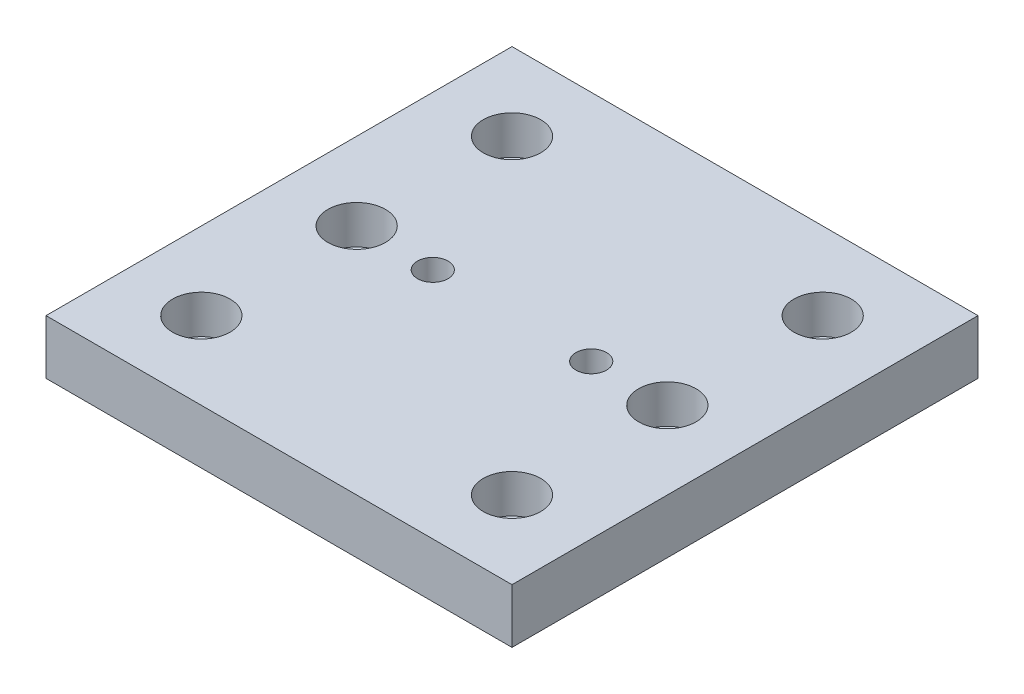
ISO-10303-21;
HEADER;
FILE_DESCRIPTION(('STEP AP214'),'2;1');
FILE_NAME('part.step','',(''),(''),'','','');
FILE_SCHEMA(('AUTOMOTIVE_DESIGN { 1 0 10303 214 1 1 1 1 }'));
ENDSEC;
DATA;
#1=APPLICATION_CONTEXT('core data for automotive mechanical design processes');
#2=APPLICATION_PROTOCOL_DEFINITION('international standard','automotive_design',2000,#1);
#3=PRODUCT_CONTEXT('',#1,'mechanical');
#4=PRODUCT('Part','Part','',(#3));
#5=PRODUCT_RELATED_PRODUCT_CATEGORY('part','',(#4));
#6=PRODUCT_DEFINITION_FORMATION('','',#4);
#7=PRODUCT_DEFINITION_CONTEXT('part definition',#1,'design');
#8=PRODUCT_DEFINITION('design','',#6,#7);
#9=PRODUCT_DEFINITION_SHAPE('','',#8);
#10=(LENGTH_UNIT() NAMED_UNIT(*) SI_UNIT(.MILLI.,.METRE.));
#11=(NAMED_UNIT(*) PLANE_ANGLE_UNIT() SI_UNIT($,.RADIAN.));
#12=(NAMED_UNIT(*) SI_UNIT($,.STERADIAN.) SOLID_ANGLE_UNIT());
#13=UNCERTAINTY_MEASURE_WITH_UNIT(LENGTH_MEASURE(1.E-05),#10,'distance_accuracy_value','');
#14=(GEOMETRIC_REPRESENTATION_CONTEXT(3) GLOBAL_UNCERTAINTY_ASSIGNED_CONTEXT((#13)) GLOBAL_UNIT_ASSIGNED_CONTEXT((#10,
#11,#12)) REPRESENTATION_CONTEXT('',''));
#15=CARTESIAN_POINT('',(0.,0.,0.));
#16=DIRECTION('',(0.,0.,1.));
#17=DIRECTION('',(1.,0.,0.));
#18=AXIS2_PLACEMENT_3D('',#15,#16,#17);
#19=CARTESIAN_POINT('',(-38.1,8.89,-38.1));
#20=DIRECTION('',(1.,0.,0.));
#21=DIRECTION('',(0.,0.,-1.));
#22=AXIS2_PLACEMENT_3D('',#19,#20,#21);
#23=PLANE('',#22);
#24=DIRECTION('',(0.,0.,1.));
#25=VECTOR('',#24,1.);
#26=CARTESIAN_POINT('',(-38.1,0.,-38.1));
#27=LINE('',#26,#25);
#28=CARTESIAN_POINT('',(-38.1,0.,-38.1));
#29=VERTEX_POINT('',#28);
#30=CARTESIAN_POINT('',(-38.1,0.,38.0999999999999));
#31=VERTEX_POINT('',#30);
#32=EDGE_CURVE('E119',#29,#31,#27,.T.);
#33=ORIENTED_EDGE('',*,*,#32,.T.);
#34=DIRECTION('',(0.,-1.,0.));
#35=VECTOR('',#34,1.);
#36=CARTESIAN_POINT('',(-38.1,8.89,38.0999999999999));
#37=LINE('',#36,#35);
#38=CARTESIAN_POINT('',(-38.1,8.89,38.0999999999999));
#39=VERTEX_POINT('',#38);
#40=EDGE_CURVE('E11',#39,#31,#37,.T.);
#41=ORIENTED_EDGE('',*,*,#40,.F.);
#42=DIRECTION('',(0.,0.,1.));
#43=VECTOR('',#42,1.);
#44=CARTESIAN_POINT('',(-38.1,8.89,-38.1));
#45=LINE('',#44,#43);
#46=CARTESIAN_POINT('',(-38.1,8.89,-38.1));
#47=VERTEX_POINT('',#46);
#48=EDGE_CURVE('E101',#47,#39,#45,.T.);
#49=ORIENTED_EDGE('',*,*,#48,.F.);
#50=DIRECTION('',(0.,-1.,0.));
#51=VECTOR('',#50,1.);
#52=CARTESIAN_POINT('',(-38.1,8.89,-38.1));
#53=LINE('',#52,#51);
#54=EDGE_CURVE('E115',#47,#29,#53,.T.);
#55=ORIENTED_EDGE('',*,*,#54,.T.);
#56=EDGE_LOOP('',(#33,#41,#49,#55));
#57=FACE_BOUND('',#56,.T.);
#58=ADVANCED_FACE('F49',(#57),#23,.F.);
#59=CARTESIAN_POINT('',(-38.1,8.89,38.0999999999999));
#60=DIRECTION('',(0.,0.,-1.));
#61=DIRECTION('',(-1.,0.,0.));
#62=AXIS2_PLACEMENT_3D('',#59,#60,#61);
#63=PLANE('',#62);
#64=DIRECTION('',(1.,0.,0.));
#65=VECTOR('',#64,1.);
#66=CARTESIAN_POINT('',(-38.1,0.,38.0999999999999));
#67=LINE('',#66,#65);
#68=CARTESIAN_POINT('',(38.1,0.,38.0999999999999));
#69=VERTEX_POINT('',#68);
#70=EDGE_CURVE('E106',#31,#69,#67,.T.);
#71=ORIENTED_EDGE('',*,*,#70,.T.);
#72=DIRECTION('',(0.,-1.,0.));
#73=VECTOR('',#72,1.);
#74=CARTESIAN_POINT('',(38.1,8.89,38.0999999999999));
#75=LINE('',#74,#73);
#76=CARTESIAN_POINT('',(38.1,8.89,38.0999999999999));
#77=VERTEX_POINT('',#76);
#78=EDGE_CURVE('E58',#77,#69,#75,.T.);
#79=ORIENTED_EDGE('',*,*,#78,.F.);
#80=DIRECTION('',(1.,0.,0.));
#81=VECTOR('',#80,1.);
#82=CARTESIAN_POINT('',(-38.1,8.89,38.0999999999999));
#83=LINE('',#82,#81);
#84=EDGE_CURVE('E96',#39,#77,#83,.T.);
#85=ORIENTED_EDGE('',*,*,#84,.F.);
#86=ORIENTED_EDGE('',*,*,#40,.T.);
#87=EDGE_LOOP('',(#71,#79,#85,#86));
#88=FACE_BOUND('',#87,.T.);
#89=ADVANCED_FACE('F105',(#88),#63,.F.);
#90=CARTESIAN_POINT('',(38.1,8.89,-38.1000000000001));
#91=DIRECTION('',(-1.,0.,0.));
#92=DIRECTION('',(0.,0.,1.));
#93=AXIS2_PLACEMENT_3D('',#90,#91,#92);
#94=PLANE('',#93);
#95=DIRECTION('',(0.,0.,-1.));
#96=VECTOR('',#95,1.);
#97=CARTESIAN_POINT('',(38.1,0.,-38.1000000000001));
#98=LINE('',#97,#96);
#99=CARTESIAN_POINT('',(38.1,0.,-38.1000000000001));
#100=VERTEX_POINT('',#99);
#101=EDGE_CURVE('E83',#69,#100,#98,.T.);
#102=ORIENTED_EDGE('',*,*,#101,.T.);
#103=DIRECTION('',(0.,-1.,0.));
#104=VECTOR('',#103,1.);
#105=CARTESIAN_POINT('',(38.1,8.89,-38.1000000000001));
#106=LINE('',#105,#104);
#107=CARTESIAN_POINT('',(38.1,8.89,-38.1000000000001));
#108=VERTEX_POINT('',#107);
#109=EDGE_CURVE('E108',#108,#100,#106,.T.);
#110=ORIENTED_EDGE('',*,*,#109,.F.);
#111=DIRECTION('',(0.,0.,-1.));
#112=VECTOR('',#111,1.);
#113=CARTESIAN_POINT('',(38.1,8.89,-38.1000000000001));
#114=LINE('',#113,#112);
#115=EDGE_CURVE('E99',#77,#108,#114,.T.);
#116=ORIENTED_EDGE('',*,*,#115,.F.);
#117=ORIENTED_EDGE('',*,*,#78,.T.);
#118=EDGE_LOOP('',(#102,#110,#116,#117));
#119=FACE_BOUND('',#118,.T.);
#120=ADVANCED_FACE('F109',(#119),#94,.F.);
#121=CARTESIAN_POINT('',(-38.1,8.89,-38.1));
#122=DIRECTION('',(0.,0.,1.));
#123=DIRECTION('',(1.,0.,0.));
#124=AXIS2_PLACEMENT_3D('',#121,#122,#123);
#125=PLANE('',#124);
#126=DIRECTION('',(-1.,0.,0.));
#127=VECTOR('',#126,1.);
#128=CARTESIAN_POINT('',(-38.1,0.,-38.1));
#129=LINE('',#128,#127);
#130=EDGE_CURVE('E89',#100,#29,#129,.T.);
#131=ORIENTED_EDGE('',*,*,#130,.T.);
#132=ORIENTED_EDGE('',*,*,#54,.F.);
#133=DIRECTION('',(-1.,0.,0.));
#134=VECTOR('',#133,1.);
#135=CARTESIAN_POINT('',(-38.1,8.89,-38.1));
#136=LINE('',#135,#134);
#137=EDGE_CURVE('E66',#108,#47,#136,.T.);
#138=ORIENTED_EDGE('',*,*,#137,.F.);
#139=ORIENTED_EDGE('',*,*,#109,.T.);
#140=EDGE_LOOP('',(#131,#132,#138,#139));
#141=FACE_BOUND('',#140,.T.);
#142=ADVANCED_FACE('F135',(#141),#125,.F.);
#143=CARTESIAN_POINT('',(0.,8.89,0.));
#144=DIRECTION('',(0.,1.,0.));
#145=DIRECTION('',(0.,0.,1.));
#146=AXIS2_PLACEMENT_3D('',#143,#144,#145);
#147=PLANE('',#146);
#148=CARTESIAN_POINT('',(-25.4,8.89,-25.4000000000001));
#149=DIRECTION('',(0.,1.,0.));
#150=DIRECTION('',(0.,0.,1.));
#151=AXIS2_PLACEMENT_3D('',#148,#149,#150);
#152=CIRCLE('',#151,4.7);
#153=CARTESIAN_POINT('',(-25.4,8.89,-20.7000000000001));
#154=VERTEX_POINT('',#153);
#155=EDGE_CURVE('E251',#154,#154,#152,.T.);
#156=ORIENTED_EDGE('',*,*,#155,.F.);
#157=EDGE_LOOP('',(#156));
#158=FACE_BOUND('',#157,.T.);
#159=CARTESIAN_POINT('',(25.4,8.89,-25.4000000000001));
#160=DIRECTION('',(0.,1.,0.));
#161=DIRECTION('',(0.,0.,1.));
#162=AXIS2_PLACEMENT_3D('',#159,#160,#161);
#163=CIRCLE('',#162,4.7);
#164=CARTESIAN_POINT('',(25.4,8.89,-20.7000000000001));
#165=VERTEX_POINT('',#164);
#166=EDGE_CURVE('E235',#165,#165,#163,.T.);
#167=ORIENTED_EDGE('',*,*,#166,.F.);
#168=EDGE_LOOP('',(#167));
#169=FACE_BOUND('',#168,.T.);
#170=CARTESIAN_POINT('',(25.4,8.89,25.3999999999999));
#171=DIRECTION('',(0.,1.,0.));
#172=DIRECTION('',(0.,0.,1.));
#173=AXIS2_PLACEMENT_3D('',#170,#171,#172);
#174=CIRCLE('',#173,4.7);
#175=CARTESIAN_POINT('',(25.4,8.89,30.0999999999999));
#176=VERTEX_POINT('',#175);
#177=EDGE_CURVE('E219',#176,#176,#174,.T.);
#178=ORIENTED_EDGE('',*,*,#177,.F.);
#179=EDGE_LOOP('',(#178));
#180=FACE_BOUND('',#179,.T.);
#181=CARTESIAN_POINT('',(-25.4,8.89,25.3999999999999));
#182=DIRECTION('',(0.,1.,0.));
#183=DIRECTION('',(0.,0.,1.));
#184=AXIS2_PLACEMENT_3D('',#181,#182,#183);
#185=CIRCLE('',#184,4.7);
#186=CARTESIAN_POINT('',(-25.4,8.89,30.0999999999999));
#187=VERTEX_POINT('',#186);
#188=EDGE_CURVE('E203',#187,#187,#185,.T.);
#189=ORIENTED_EDGE('',*,*,#188,.F.);
#190=EDGE_LOOP('',(#189));
#191=FACE_BOUND('',#190,.T.);
#192=CARTESIAN_POINT('',(-25.4,8.89,0.));
#193=DIRECTION('',(0.,1.,0.));
#194=DIRECTION('',(0.,0.,1.));
#195=AXIS2_PLACEMENT_3D('',#192,#193,#194);
#196=CIRCLE('',#195,4.7);
#197=CARTESIAN_POINT('',(-25.4,8.89,4.69999999999993));
#198=VERTEX_POINT('',#197);
#199=EDGE_CURVE('E187',#198,#198,#196,.T.);
#200=ORIENTED_EDGE('',*,*,#199,.F.);
#201=EDGE_LOOP('',(#200));
#202=FACE_BOUND('',#201,.T.);
#203=CARTESIAN_POINT('',(25.4,8.89,0.));
#204=DIRECTION('',(0.,1.,0.));
#205=DIRECTION('',(0.,0.,1.));
#206=AXIS2_PLACEMENT_3D('',#203,#204,#205);
#207=CIRCLE('',#206,4.7);
#208=CARTESIAN_POINT('',(25.4,8.89,4.69999999999993));
#209=VERTEX_POINT('',#208);
#210=EDGE_CURVE('E171',#209,#209,#207,.T.);
#211=ORIENTED_EDGE('',*,*,#210,.F.);
#212=EDGE_LOOP('',(#211));
#213=FACE_BOUND('',#212,.T.);
#214=CARTESIAN_POINT('',(-12.954,8.89,0.));
#215=DIRECTION('',(0.,1.,0.));
#216=DIRECTION('',(0.,0.,1.));
#217=AXIS2_PLACEMENT_3D('',#214,#215,#216);
#218=CIRCLE('',#217,2.49999999999999);
#219=CARTESIAN_POINT('',(-12.954,8.89,2.49999999999993));
#220=VERTEX_POINT('',#219);
#221=EDGE_CURVE('E155',#220,#220,#218,.T.);
#222=ORIENTED_EDGE('',*,*,#221,.F.);
#223=EDGE_LOOP('',(#222));
#224=FACE_BOUND('',#223,.T.);
#225=CARTESIAN_POINT('',(12.954,8.89,0.));
#226=DIRECTION('',(0.,1.,0.));
#227=DIRECTION('',(0.,0.,1.));
#228=AXIS2_PLACEMENT_3D('',#225,#226,#227);
#229=CIRCLE('',#228,2.49999999999999);
#230=CARTESIAN_POINT('',(12.954,8.89,2.49999999999991));
#231=VERTEX_POINT('',#230);
#232=EDGE_CURVE('E147',#231,#231,#229,.T.);
#233=ORIENTED_EDGE('',*,*,#232,.F.);
#234=EDGE_LOOP('',(#233));
#235=FACE_BOUND('',#234,.T.);
#236=ORIENTED_EDGE('',*,*,#48,.T.);
#237=ORIENTED_EDGE('',*,*,#84,.T.);
#238=ORIENTED_EDGE('',*,*,#115,.T.);
#239=ORIENTED_EDGE('',*,*,#137,.T.);
#240=EDGE_LOOP('',(#236,#237,#238,#239));
#241=FACE_BOUND('',#240,.T.);
#242=ADVANCED_FACE('F97',(#158,#169,#180,#191,#202,#213,#224,#235,#241),#147,.T.);
#243=CARTESIAN_POINT('',(0.,0.,0.));
#244=DIRECTION('',(0.,1.,0.));
#245=DIRECTION('',(0.,0.,1.));
#246=AXIS2_PLACEMENT_3D('',#243,#244,#245);
#247=PLANE('',#246);
#248=CARTESIAN_POINT('',(-25.4,0.,-25.4000000000001));
#249=DIRECTION('',(0.,1.,0.));
#250=DIRECTION('',(0.,0.,1.));
#251=AXIS2_PLACEMENT_3D('',#248,#249,#250);
#252=CIRCLE('',#251,3.3);
#253=CARTESIAN_POINT('',(-25.4,0.,-22.1000000000001));
#254=VERTEX_POINT('',#253);
#255=EDGE_CURVE('E239',#254,#254,#252,.T.);
#256=ORIENTED_EDGE('',*,*,#255,.T.);
#257=EDGE_LOOP('',(#256));
#258=FACE_BOUND('',#257,.T.);
#259=CARTESIAN_POINT('',(25.4,0.,-25.4000000000001));
#260=DIRECTION('',(0.,1.,0.));
#261=DIRECTION('',(0.,0.,1.));
#262=AXIS2_PLACEMENT_3D('',#259,#260,#261);
#263=CIRCLE('',#262,3.3);
#264=CARTESIAN_POINT('',(25.4,0.,-22.1000000000001));
#265=VERTEX_POINT('',#264);
#266=EDGE_CURVE('E223',#265,#265,#263,.T.);
#267=ORIENTED_EDGE('',*,*,#266,.T.);
#268=EDGE_LOOP('',(#267));
#269=FACE_BOUND('',#268,.T.);
#270=CARTESIAN_POINT('',(25.4,0.,25.3999999999999));
#271=DIRECTION('',(0.,1.,0.));
#272=DIRECTION('',(0.,0.,1.));
#273=AXIS2_PLACEMENT_3D('',#270,#271,#272);
#274=CIRCLE('',#273,3.3);
#275=CARTESIAN_POINT('',(25.4,0.,28.6999999999999));
#276=VERTEX_POINT('',#275);
#277=EDGE_CURVE('E207',#276,#276,#274,.T.);
#278=ORIENTED_EDGE('',*,*,#277,.T.);
#279=EDGE_LOOP('',(#278));
#280=FACE_BOUND('',#279,.T.);
#281=CARTESIAN_POINT('',(-25.4,0.,25.3999999999999));
#282=DIRECTION('',(0.,1.,0.));
#283=DIRECTION('',(0.,0.,1.));
#284=AXIS2_PLACEMENT_3D('',#281,#282,#283);
#285=CIRCLE('',#284,3.3);
#286=CARTESIAN_POINT('',(-25.4,0.,28.6999999999999));
#287=VERTEX_POINT('',#286);
#288=EDGE_CURVE('E191',#287,#287,#285,.T.);
#289=ORIENTED_EDGE('',*,*,#288,.T.);
#290=EDGE_LOOP('',(#289));
#291=FACE_BOUND('',#290,.T.);
#292=CARTESIAN_POINT('',(-25.4,0.,0.));
#293=DIRECTION('',(0.,1.,0.));
#294=DIRECTION('',(0.,0.,1.));
#295=AXIS2_PLACEMENT_3D('',#292,#293,#294);
#296=CIRCLE('',#295,3.3);
#297=CARTESIAN_POINT('',(-25.4,0.,3.29999999999992));
#298=VERTEX_POINT('',#297);
#299=EDGE_CURVE('E175',#298,#298,#296,.T.);
#300=ORIENTED_EDGE('',*,*,#299,.T.);
#301=EDGE_LOOP('',(#300));
#302=FACE_BOUND('',#301,.T.);
#303=CARTESIAN_POINT('',(25.4,0.,0.));
#304=DIRECTION('',(0.,1.,0.));
#305=DIRECTION('',(0.,0.,1.));
#306=AXIS2_PLACEMENT_3D('',#303,#304,#305);
#307=CIRCLE('',#306,3.3);
#308=CARTESIAN_POINT('',(25.4,0.,3.29999999999993));
#309=VERTEX_POINT('',#308);
#310=EDGE_CURVE('E159',#309,#309,#307,.T.);
#311=ORIENTED_EDGE('',*,*,#310,.T.);
#312=EDGE_LOOP('',(#311));
#313=FACE_BOUND('',#312,.T.);
#314=CARTESIAN_POINT('',(-12.954,0.,0.));
#315=DIRECTION('',(0.,1.,0.));
#316=DIRECTION('',(0.,0.,1.));
#317=AXIS2_PLACEMENT_3D('',#314,#315,#316);
#318=CIRCLE('',#317,2.5);
#319=CARTESIAN_POINT('',(-12.954,0.,2.49999999999994));
#320=VERTEX_POINT('',#319);
#321=EDGE_CURVE('E151',#320,#320,#318,.T.);
#322=ORIENTED_EDGE('',*,*,#321,.T.);
#323=EDGE_LOOP('',(#322));
#324=FACE_BOUND('',#323,.T.);
#325=CARTESIAN_POINT('',(12.954,0.,0.));
#326=DIRECTION('',(0.,1.,0.));
#327=DIRECTION('',(0.,0.,1.));
#328=AXIS2_PLACEMENT_3D('',#325,#326,#327);
#329=CIRCLE('',#328,2.5);
#330=CARTESIAN_POINT('',(12.954,0.,2.49999999999992));
#331=VERTEX_POINT('',#330);
#332=EDGE_CURVE('E123',#331,#331,#329,.T.);
#333=ORIENTED_EDGE('',*,*,#332,.T.);
#334=EDGE_LOOP('',(#333));
#335=FACE_BOUND('',#334,.T.);
#336=ORIENTED_EDGE('',*,*,#32,.F.);
#337=ORIENTED_EDGE('',*,*,#130,.F.);
#338=ORIENTED_EDGE('',*,*,#101,.F.);
#339=ORIENTED_EDGE('',*,*,#70,.F.);
#340=EDGE_LOOP('',(#336,#337,#338,#339));
#341=FACE_BOUND('',#340,.T.);
#342=ADVANCED_FACE('F138',(#258,#269,#280,#291,#302,#313,#324,#335,#341),#247,.F.);
#343=CARTESIAN_POINT('',(12.954,8.89,0.));
#344=DIRECTION('',(0.,1.,0.));
#345=DIRECTION('',(0.,0.,1.));
#346=AXIS2_PLACEMENT_3D('',#343,#344,#345);
#347=CYLINDRICAL_SURFACE('',#346,2.49999999999999);
#348=ORIENTED_EDGE('',*,*,#332,.F.);
#349=EDGE_LOOP('',(#348));
#350=FACE_BOUND('',#349,.T.);
#351=ORIENTED_EDGE('',*,*,#232,.T.);
#352=EDGE_LOOP('',(#351));
#353=FACE_BOUND('',#352,.T.);
#354=ADVANCED_FACE('F277',(#350,#353),#347,.F.);
#355=CARTESIAN_POINT('',(-12.954,8.89,0.));
#356=DIRECTION('',(0.,1.,0.));
#357=DIRECTION('',(0.,0.,1.));
#358=AXIS2_PLACEMENT_3D('',#355,#356,#357);
#359=CYLINDRICAL_SURFACE('',#358,2.49999999999999);
#360=ORIENTED_EDGE('',*,*,#321,.F.);
#361=EDGE_LOOP('',(#360));
#362=FACE_BOUND('',#361,.T.);
#363=ORIENTED_EDGE('',*,*,#221,.T.);
#364=EDGE_LOOP('',(#363));
#365=FACE_BOUND('',#364,.T.);
#366=ADVANCED_FACE('F279',(#362,#365),#359,.F.);
#367=CARTESIAN_POINT('',(25.4,8.89,0.));
#368=DIRECTION('',(0.,1.,0.));
#369=DIRECTION('',(0.,0.,1.));
#370=AXIS2_PLACEMENT_3D('',#367,#368,#369);
#371=CYLINDRICAL_SURFACE('',#370,3.3);
#372=ORIENTED_EDGE('',*,*,#310,.F.);
#373=EDGE_LOOP('',(#372));
#374=FACE_BOUND('',#373,.T.);
#375=CARTESIAN_POINT('',(25.4,2.59,0.));
#376=DIRECTION('',(0.,1.,0.));
#377=DIRECTION('',(0.,0.,1.));
#378=AXIS2_PLACEMENT_3D('',#375,#376,#377);
#379=CIRCLE('',#378,3.3);
#380=CARTESIAN_POINT('',(25.4,2.59,3.29999999999993));
#381=VERTEX_POINT('',#380);
#382=EDGE_CURVE('E163',#381,#381,#379,.T.);
#383=ORIENTED_EDGE('',*,*,#382,.T.);
#384=EDGE_LOOP('',(#383));
#385=FACE_BOUND('',#384,.T.);
#386=ADVANCED_FACE('F286',(#374,#385),#371,.F.);
#387=CARTESIAN_POINT('',(28.7,2.59,0.));
#388=DIRECTION('',(0.,-1.,0.));
#389=DIRECTION('',(0.,0.,-1.));
#390=AXIS2_PLACEMENT_3D('',#387,#388,#389);
#391=PLANE('',#390);
#392=ORIENTED_EDGE('',*,*,#382,.F.);
#393=EDGE_LOOP('',(#392));
#394=FACE_BOUND('',#393,.T.);
#395=CARTESIAN_POINT('',(25.4,2.59,0.));
#396=DIRECTION('',(0.,1.,0.));
#397=DIRECTION('',(0.,0.,1.));
#398=AXIS2_PLACEMENT_3D('',#395,#396,#397);
#399=CIRCLE('',#398,4.7);
#400=CARTESIAN_POINT('',(25.4,2.59,4.69999999999993));
#401=VERTEX_POINT('',#400);
#402=EDGE_CURVE('E167',#401,#401,#399,.T.);
#403=ORIENTED_EDGE('',*,*,#402,.T.);
#404=EDGE_LOOP('',(#403));
#405=FACE_BOUND('',#404,.T.);
#406=ADVANCED_FACE('F327',(#394,#405),#391,.F.);
#407=CARTESIAN_POINT('',(25.4,8.89,0.));
#408=DIRECTION('',(0.,1.,0.));
#409=DIRECTION('',(0.,0.,1.));
#410=AXIS2_PLACEMENT_3D('',#407,#408,#409);
#411=CYLINDRICAL_SURFACE('',#410,4.7);
#412=ORIENTED_EDGE('',*,*,#402,.F.);
#413=EDGE_LOOP('',(#412));
#414=FACE_BOUND('',#413,.T.);
#415=ORIENTED_EDGE('',*,*,#210,.T.);
#416=EDGE_LOOP('',(#415));
#417=FACE_BOUND('',#416,.T.);
#418=ADVANCED_FACE('F336',(#414,#417),#411,.F.);
#419=CARTESIAN_POINT('',(-25.4,8.89,0.));
#420=DIRECTION('',(0.,1.,0.));
#421=DIRECTION('',(0.,0.,1.));
#422=AXIS2_PLACEMENT_3D('',#419,#420,#421);
#423=CYLINDRICAL_SURFACE('',#422,3.3);
#424=ORIENTED_EDGE('',*,*,#299,.F.);
#425=EDGE_LOOP('',(#424));
#426=FACE_BOUND('',#425,.T.);
#427=CARTESIAN_POINT('',(-25.4,2.59,0.));
#428=DIRECTION('',(0.,1.,0.));
#429=DIRECTION('',(0.,0.,1.));
#430=AXIS2_PLACEMENT_3D('',#427,#428,#429);
#431=CIRCLE('',#430,3.3);
#432=CARTESIAN_POINT('',(-25.4,2.59,3.29999999999992));
#433=VERTEX_POINT('',#432);
#434=EDGE_CURVE('E179',#433,#433,#431,.T.);
#435=ORIENTED_EDGE('',*,*,#434,.T.);
#436=EDGE_LOOP('',(#435));
#437=FACE_BOUND('',#436,.T.);
#438=ADVANCED_FACE('F345',(#426,#437),#423,.F.);
#439=CARTESIAN_POINT('',(-22.1,2.59,0.));
#440=DIRECTION('',(0.,-1.,0.));
#441=DIRECTION('',(0.,0.,-1.));
#442=AXIS2_PLACEMENT_3D('',#439,#440,#441);
#443=PLANE('',#442);
#444=ORIENTED_EDGE('',*,*,#434,.F.);
#445=EDGE_LOOP('',(#444));
#446=FACE_BOUND('',#445,.T.);
#447=CARTESIAN_POINT('',(-25.4,2.59,0.));
#448=DIRECTION('',(0.,1.,0.));
#449=DIRECTION('',(0.,0.,1.));
#450=AXIS2_PLACEMENT_3D('',#447,#448,#449);
#451=CIRCLE('',#450,4.7);
#452=CARTESIAN_POINT('',(-25.4,2.59,4.69999999999993));
#453=VERTEX_POINT('',#452);
#454=EDGE_CURVE('E183',#453,#453,#451,.T.);
#455=ORIENTED_EDGE('',*,*,#454,.T.);
#456=EDGE_LOOP('',(#455));
#457=FACE_BOUND('',#456,.T.);
#458=ADVANCED_FACE('F354',(#446,#457),#443,.F.);
#459=CARTESIAN_POINT('',(-25.4,8.89,0.));
#460=DIRECTION('',(0.,1.,0.));
#461=DIRECTION('',(0.,0.,1.));
#462=AXIS2_PLACEMENT_3D('',#459,#460,#461);
#463=CYLINDRICAL_SURFACE('',#462,4.7);
#464=ORIENTED_EDGE('',*,*,#454,.F.);
#465=EDGE_LOOP('',(#464));
#466=FACE_BOUND('',#465,.T.);
#467=ORIENTED_EDGE('',*,*,#199,.T.);
#468=EDGE_LOOP('',(#467));
#469=FACE_BOUND('',#468,.T.);
#470=ADVANCED_FACE('F363',(#466,#469),#463,.F.);
#471=CARTESIAN_POINT('',(-25.4,8.89,25.3999999999999));
#472=DIRECTION('',(0.,1.,0.));
#473=DIRECTION('',(0.,0.,1.));
#474=AXIS2_PLACEMENT_3D('',#471,#472,#473);
#475=CYLINDRICAL_SURFACE('',#474,3.3);
#476=ORIENTED_EDGE('',*,*,#288,.F.);
#477=EDGE_LOOP('',(#476));
#478=FACE_BOUND('',#477,.T.);
#479=CARTESIAN_POINT('',(-25.4,2.59,25.3999999999999));
#480=DIRECTION('',(0.,1.,0.));
#481=DIRECTION('',(0.,0.,1.));
#482=AXIS2_PLACEMENT_3D('',#479,#480,#481);
#483=CIRCLE('',#482,3.3);
#484=CARTESIAN_POINT('',(-25.4,2.59,28.6999999999999));
#485=VERTEX_POINT('',#484);
#486=EDGE_CURVE('E195',#485,#485,#483,.T.);
#487=ORIENTED_EDGE('',*,*,#486,.T.);
#488=EDGE_LOOP('',(#487));
#489=FACE_BOUND('',#488,.T.);
#490=ADVANCED_FACE('F372',(#478,#489),#475,.F.);
#491=CARTESIAN_POINT('',(-22.1,2.59,25.3999999999999));
#492=DIRECTION('',(0.,-1.,0.));
#493=DIRECTION('',(0.,0.,-1.));
#494=AXIS2_PLACEMENT_3D('',#491,#492,#493);
#495=PLANE('',#494);
#496=ORIENTED_EDGE('',*,*,#486,.F.);
#497=EDGE_LOOP('',(#496));
#498=FACE_BOUND('',#497,.T.);
#499=CARTESIAN_POINT('',(-25.4,2.59,25.3999999999999));
#500=DIRECTION('',(0.,1.,0.));
#501=DIRECTION('',(0.,0.,1.));
#502=AXIS2_PLACEMENT_3D('',#499,#500,#501);
#503=CIRCLE('',#502,4.7);
#504=CARTESIAN_POINT('',(-25.4,2.59,30.0999999999999));
#505=VERTEX_POINT('',#504);
#506=EDGE_CURVE('E199',#505,#505,#503,.T.);
#507=ORIENTED_EDGE('',*,*,#506,.T.);
#508=EDGE_LOOP('',(#507));
#509=FACE_BOUND('',#508,.T.);
#510=ADVANCED_FACE('F381',(#498,#509),#495,.F.);
#511=CARTESIAN_POINT('',(-25.4,8.89,25.3999999999999));
#512=DIRECTION('',(0.,1.,0.));
#513=DIRECTION('',(0.,0.,1.));
#514=AXIS2_PLACEMENT_3D('',#511,#512,#513);
#515=CYLINDRICAL_SURFACE('',#514,4.7);
#516=ORIENTED_EDGE('',*,*,#506,.F.);
#517=EDGE_LOOP('',(#516));
#518=FACE_BOUND('',#517,.T.);
#519=ORIENTED_EDGE('',*,*,#188,.T.);
#520=EDGE_LOOP('',(#519));
#521=FACE_BOUND('',#520,.T.);
#522=ADVANCED_FACE('F390',(#518,#521),#515,.F.);
#523=CARTESIAN_POINT('',(25.4,8.89,25.3999999999999));
#524=DIRECTION('',(0.,1.,0.));
#525=DIRECTION('',(0.,0.,1.));
#526=AXIS2_PLACEMENT_3D('',#523,#524,#525);
#527=CYLINDRICAL_SURFACE('',#526,3.3);
#528=ORIENTED_EDGE('',*,*,#277,.F.);
#529=EDGE_LOOP('',(#528));
#530=FACE_BOUND('',#529,.T.);
#531=CARTESIAN_POINT('',(25.4,2.59,25.3999999999999));
#532=DIRECTION('',(0.,1.,0.));
#533=DIRECTION('',(0.,0.,1.));
#534=AXIS2_PLACEMENT_3D('',#531,#532,#533);
#535=CIRCLE('',#534,3.3);
#536=CARTESIAN_POINT('',(25.4,2.59,28.6999999999999));
#537=VERTEX_POINT('',#536);
#538=EDGE_CURVE('E211',#537,#537,#535,.T.);
#539=ORIENTED_EDGE('',*,*,#538,.T.);
#540=EDGE_LOOP('',(#539));
#541=FACE_BOUND('',#540,.T.);
#542=ADVANCED_FACE('F399',(#530,#541),#527,.F.);
#543=CARTESIAN_POINT('',(28.7,2.59,25.3999999999999));
#544=DIRECTION('',(0.,-1.,0.));
#545=DIRECTION('',(0.,0.,-1.));
#546=AXIS2_PLACEMENT_3D('',#543,#544,#545);
#547=PLANE('',#546);
#548=ORIENTED_EDGE('',*,*,#538,.F.);
#549=EDGE_LOOP('',(#548));
#550=FACE_BOUND('',#549,.T.);
#551=CARTESIAN_POINT('',(25.4,2.59,25.3999999999999));
#552=DIRECTION('',(0.,1.,0.));
#553=DIRECTION('',(0.,0.,1.));
#554=AXIS2_PLACEMENT_3D('',#551,#552,#553);
#555=CIRCLE('',#554,4.7);
#556=CARTESIAN_POINT('',(25.4,2.59,30.0999999999999));
#557=VERTEX_POINT('',#556);
#558=EDGE_CURVE('E215',#557,#557,#555,.T.);
#559=ORIENTED_EDGE('',*,*,#558,.T.);
#560=EDGE_LOOP('',(#559));
#561=FACE_BOUND('',#560,.T.);
#562=ADVANCED_FACE('F408',(#550,#561),#547,.F.);
#563=CARTESIAN_POINT('',(25.4,8.89,25.3999999999999));
#564=DIRECTION('',(0.,1.,0.));
#565=DIRECTION('',(0.,0.,1.));
#566=AXIS2_PLACEMENT_3D('',#563,#564,#565);
#567=CYLINDRICAL_SURFACE('',#566,4.7);
#568=ORIENTED_EDGE('',*,*,#558,.F.);
#569=EDGE_LOOP('',(#568));
#570=FACE_BOUND('',#569,.T.);
#571=ORIENTED_EDGE('',*,*,#177,.T.);
#572=EDGE_LOOP('',(#571));
#573=FACE_BOUND('',#572,.T.);
#574=ADVANCED_FACE('F417',(#570,#573),#567,.F.);
#575=CARTESIAN_POINT('',(25.4,8.89,-25.4000000000001));
#576=DIRECTION('',(0.,1.,0.));
#577=DIRECTION('',(0.,0.,1.));
#578=AXIS2_PLACEMENT_3D('',#575,#576,#577);
#579=CYLINDRICAL_SURFACE('',#578,3.3);
#580=ORIENTED_EDGE('',*,*,#266,.F.);
#581=EDGE_LOOP('',(#580));
#582=FACE_BOUND('',#581,.T.);
#583=CARTESIAN_POINT('',(25.4,2.59,-25.4000000000001));
#584=DIRECTION('',(0.,1.,0.));
#585=DIRECTION('',(0.,0.,1.));
#586=AXIS2_PLACEMENT_3D('',#583,#584,#585);
#587=CIRCLE('',#586,3.3);
#588=CARTESIAN_POINT('',(25.4,2.59,-22.1000000000001));
#589=VERTEX_POINT('',#588);
#590=EDGE_CURVE('E227',#589,#589,#587,.T.);
#591=ORIENTED_EDGE('',*,*,#590,.T.);
#592=EDGE_LOOP('',(#591));
#593=FACE_BOUND('',#592,.T.);
#594=ADVANCED_FACE('F426',(#582,#593),#579,.F.);
#595=CARTESIAN_POINT('',(28.7,2.59,-25.4000000000001));
#596=DIRECTION('',(0.,-1.,0.));
#597=DIRECTION('',(0.,0.,-1.));
#598=AXIS2_PLACEMENT_3D('',#595,#596,#597);
#599=PLANE('',#598);
#600=ORIENTED_EDGE('',*,*,#590,.F.);
#601=EDGE_LOOP('',(#600));
#602=FACE_BOUND('',#601,.T.);
#603=CARTESIAN_POINT('',(25.4,2.59,-25.4000000000001));
#604=DIRECTION('',(0.,1.,0.));
#605=DIRECTION('',(0.,0.,1.));
#606=AXIS2_PLACEMENT_3D('',#603,#604,#605);
#607=CIRCLE('',#606,4.7);
#608=CARTESIAN_POINT('',(25.4,2.59,-20.7000000000001));
#609=VERTEX_POINT('',#608);
#610=EDGE_CURVE('E231',#609,#609,#607,.T.);
#611=ORIENTED_EDGE('',*,*,#610,.T.);
#612=EDGE_LOOP('',(#611));
#613=FACE_BOUND('',#612,.T.);
#614=ADVANCED_FACE('F435',(#602,#613),#599,.F.);
#615=CARTESIAN_POINT('',(25.4,8.89,-25.4000000000001));
#616=DIRECTION('',(0.,1.,0.));
#617=DIRECTION('',(0.,0.,1.));
#618=AXIS2_PLACEMENT_3D('',#615,#616,#617);
#619=CYLINDRICAL_SURFACE('',#618,4.7);
#620=ORIENTED_EDGE('',*,*,#610,.F.);
#621=EDGE_LOOP('',(#620));
#622=FACE_BOUND('',#621,.T.);
#623=ORIENTED_EDGE('',*,*,#166,.T.);
#624=EDGE_LOOP('',(#623));
#625=FACE_BOUND('',#624,.T.);
#626=ADVANCED_FACE('F444',(#622,#625),#619,.F.);
#627=CARTESIAN_POINT('',(-25.4,8.89,-25.4000000000001));
#628=DIRECTION('',(0.,1.,0.));
#629=DIRECTION('',(0.,0.,1.));
#630=AXIS2_PLACEMENT_3D('',#627,#628,#629);
#631=CYLINDRICAL_SURFACE('',#630,3.3);
#632=ORIENTED_EDGE('',*,*,#255,.F.);
#633=EDGE_LOOP('',(#632));
#634=FACE_BOUND('',#633,.T.);
#635=CARTESIAN_POINT('',(-25.4,2.59,-25.4000000000001));
#636=DIRECTION('',(0.,1.,0.));
#637=DIRECTION('',(0.,0.,1.));
#638=AXIS2_PLACEMENT_3D('',#635,#636,#637);
#639=CIRCLE('',#638,3.3);
#640=CARTESIAN_POINT('',(-25.4,2.59,-22.1000000000001));
#641=VERTEX_POINT('',#640);
#642=EDGE_CURVE('E243',#641,#641,#639,.T.);
#643=ORIENTED_EDGE('',*,*,#642,.T.);
#644=EDGE_LOOP('',(#643));
#645=FACE_BOUND('',#644,.T.);
#646=ADVANCED_FACE('F453',(#634,#645),#631,.F.);
#647=CARTESIAN_POINT('',(-22.1,2.59,-25.4000000000001));
#648=DIRECTION('',(0.,-1.,0.));
#649=DIRECTION('',(0.,0.,-1.));
#650=AXIS2_PLACEMENT_3D('',#647,#648,#649);
#651=PLANE('',#650);
#652=ORIENTED_EDGE('',*,*,#642,.F.);
#653=EDGE_LOOP('',(#652));
#654=FACE_BOUND('',#653,.T.);
#655=CARTESIAN_POINT('',(-25.4,2.59,-25.4000000000001));
#656=DIRECTION('',(0.,1.,0.));
#657=DIRECTION('',(0.,0.,1.));
#658=AXIS2_PLACEMENT_3D('',#655,#656,#657);
#659=CIRCLE('',#658,4.7);
#660=CARTESIAN_POINT('',(-25.4,2.59,-20.7000000000001));
#661=VERTEX_POINT('',#660);
#662=EDGE_CURVE('E247',#661,#661,#659,.T.);
#663=ORIENTED_EDGE('',*,*,#662,.T.);
#664=EDGE_LOOP('',(#663));
#665=FACE_BOUND('',#664,.T.);
#666=ADVANCED_FACE('F462',(#654,#665),#651,.F.);
#667=CARTESIAN_POINT('',(-25.4,8.89,-25.4000000000001));
#668=DIRECTION('',(0.,1.,0.));
#669=DIRECTION('',(0.,0.,1.));
#670=AXIS2_PLACEMENT_3D('',#667,#668,#669);
#671=CYLINDRICAL_SURFACE('',#670,4.7);
#672=ORIENTED_EDGE('',*,*,#662,.F.);
#673=EDGE_LOOP('',(#672));
#674=FACE_BOUND('',#673,.T.);
#675=ORIENTED_EDGE('',*,*,#155,.T.);
#676=EDGE_LOOP('',(#675));
#677=FACE_BOUND('',#676,.T.);
#678=ADVANCED_FACE('F258',(#674,#677),#671,.F.);
#679=CLOSED_SHELL('',(#58,#89,#120,#142,#242,#342,#354,#366,#386,#406,#418,#438,#458,#470,#490,
#510,#522,#542,#562,#574,#594,#614,#626,#646,#666,#678));
#680=MANIFOLD_SOLID_BREP('B2',#679);
#681=ADVANCED_BREP_SHAPE_REPRESENTATION('',(#18,#680),#14);
#682=SHAPE_DEFINITION_REPRESENTATION(#9,#681);
ENDSEC;
END-ISO-10303-21;
